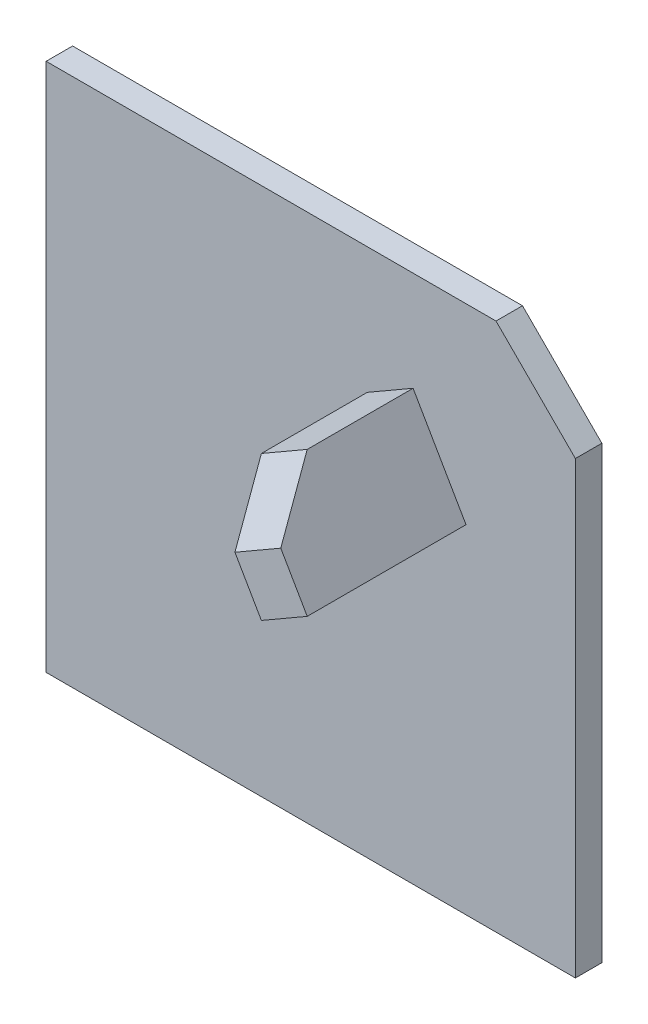
ISO-10303-21;
HEADER;
FILE_DESCRIPTION(('STEP AP214'),'2;1');
FILE_NAME('part.step','',(''),(''),'','','');
FILE_SCHEMA(('AUTOMOTIVE_DESIGN { 1 0 10303 214 1 1 1 1 }'));
ENDSEC;
DATA;
#1=APPLICATION_CONTEXT('core data for automotive mechanical design processes');
#2=APPLICATION_PROTOCOL_DEFINITION('international standard','automotive_design',2000,#1);
#3=PRODUCT_CONTEXT('',#1,'mechanical');
#4=PRODUCT('Part','Part','',(#3));
#5=PRODUCT_RELATED_PRODUCT_CATEGORY('part','',(#4));
#6=PRODUCT_DEFINITION_FORMATION('','',#4);
#7=PRODUCT_DEFINITION_CONTEXT('part definition',#1,'design');
#8=PRODUCT_DEFINITION('design','',#6,#7);
#9=PRODUCT_DEFINITION_SHAPE('','',#8);
#10=(LENGTH_UNIT() NAMED_UNIT(*) SI_UNIT(.MILLI.,.METRE.));
#11=(NAMED_UNIT(*) PLANE_ANGLE_UNIT() SI_UNIT($,.RADIAN.));
#12=(NAMED_UNIT(*) SI_UNIT($,.STERADIAN.) SOLID_ANGLE_UNIT());
#13=UNCERTAINTY_MEASURE_WITH_UNIT(LENGTH_MEASURE(1.E-05),#10,'distance_accuracy_value','');
#14=(GEOMETRIC_REPRESENTATION_CONTEXT(3) GLOBAL_UNCERTAINTY_ASSIGNED_CONTEXT((#13)) GLOBAL_UNIT_ASSIGNED_CONTEXT((#10,
#11,#12)) REPRESENTATION_CONTEXT('',''));
#15=CARTESIAN_POINT('',(0.,0.,0.));
#16=DIRECTION('',(0.,0.,1.));
#17=DIRECTION('',(1.,0.,0.));
#18=AXIS2_PLACEMENT_3D('',#15,#16,#17);
#19=CARTESIAN_POINT('',(53.349364905389,130.801270189222,175.));
#20=DIRECTION('',(0.866025403784438,0.500000000000001,0.));
#21=DIRECTION('',(-0.500000000000001,0.866025403784438,0.));
#22=AXIS2_PLACEMENT_3D('',#19,#20,#21);
#23=PLANE('',#22);
#24=DIRECTION('',(0.500000000000001,-0.866025403784438,0.));
#25=VECTOR('',#24,1.);
#26=CARTESIAN_POINT('',(53.349364905389,130.801270189222,175.));
#27=LINE('',#26,#25);
#28=CARTESIAN_POINT('',(78.349364905389,87.5,175.));
#29=VERTEX_POINT('',#28);
#30=CARTESIAN_POINT('',(103.349364905389,44.198729810778,175.));
#31=VERTEX_POINT('',#30);
#32=EDGE_CURVE('E191',#29,#31,#27,.T.);
#33=ORIENTED_EDGE('',*,*,#32,.F.);
#34=DIRECTION('',(0.353553390593273,-0.612372435695791,0.707106781186551));
#35=VECTOR('',#34,1.);
#36=CARTESIAN_POINT('',(53.349364905389,130.801270189222,124.999999999999));
#37=LINE('',#36,#35);
#38=CARTESIAN_POINT('',(53.349364905389,130.801270189222,124.999999999999));
#39=VERTEX_POINT('',#38);
#40=EDGE_CURVE('E54',#39,#29,#37,.T.);
#41=ORIENTED_EDGE('',*,*,#40,.F.);
#42=DIRECTION('',(0.,0.,-1.));
#43=VECTOR('',#42,1.);
#44=CARTESIAN_POINT('',(53.349364905389,130.801270189222,175.));
#45=LINE('',#44,#43);
#46=CARTESIAN_POINT('',(53.349364905389,130.801270189222,25.));
#47=VERTEX_POINT('',#46);
#48=EDGE_CURVE('E200',#39,#47,#45,.T.);
#49=ORIENTED_EDGE('',*,*,#48,.T.);
#50=DIRECTION('',(0.500000000000001,-0.866025403784438,0.));
#51=VECTOR('',#50,1.);
#52=CARTESIAN_POINT('',(53.349364905389,130.801270189222,25.));
#53=LINE('',#52,#51);
#54=CARTESIAN_POINT('',(103.349364905389,44.198729810778,25.));
#55=VERTEX_POINT('',#54);
#56=EDGE_CURVE('E190',#47,#55,#53,.T.);
#57=ORIENTED_EDGE('',*,*,#56,.T.);
#58=DIRECTION('',(0.,0.,-1.));
#59=VECTOR('',#58,1.);
#60=CARTESIAN_POINT('',(103.349364905389,44.198729810778,175.));
#61=LINE('',#60,#59);
#62=EDGE_CURVE('E48',#31,#55,#61,.T.);
#63=ORIENTED_EDGE('',*,*,#62,.F.);
#64=EDGE_LOOP('',(#33,#41,#49,#57,#63));
#65=FACE_BOUND('',#64,.T.);
#66=ADVANCED_FACE('F40',(#65),#23,.F.);
#67=CARTESIAN_POINT('',(103.349364905389,44.198729810778,175.));
#68=DIRECTION('',(-0.500000000000001,0.866025403784438,0.));
#69=DIRECTION('',(0.,0.,1.));
#70=AXIS2_PLACEMENT_3D('',#67,#68,#69);
#71=PLANE('',#70);
#72=DIRECTION('',(0.866025403784438,0.500000000000001,0.));
#73=VECTOR('',#72,1.);
#74=CARTESIAN_POINT('',(103.349364905389,44.198729810778,25.));
#75=LINE('',#74,#73);
#76=CARTESIAN_POINT('',(146.650635094611,69.1987298107781,25.));
#77=VERTEX_POINT('',#76);
#78=EDGE_CURVE('E204',#55,#77,#75,.T.);
#79=ORIENTED_EDGE('',*,*,#78,.T.);
#80=DIRECTION('',(0.,0.,-1.));
#81=VECTOR('',#80,1.);
#82=CARTESIAN_POINT('',(146.650635094611,69.1987298107781,175.));
#83=LINE('',#82,#81);
#84=CARTESIAN_POINT('',(146.650635094611,69.1987298107781,175.));
#85=VERTEX_POINT('',#84);
#86=EDGE_CURVE('E219',#85,#77,#83,.T.);
#87=ORIENTED_EDGE('',*,*,#86,.F.);
#88=DIRECTION('',(0.866025403784438,0.500000000000001,0.));
#89=VECTOR('',#88,1.);
#90=CARTESIAN_POINT('',(103.349364905389,44.198729810778,175.));
#91=LINE('',#90,#89);
#92=EDGE_CURVE('E63',#31,#85,#91,.T.);
#93=ORIENTED_EDGE('',*,*,#92,.F.);
#94=ORIENTED_EDGE('',*,*,#62,.T.);
#95=EDGE_LOOP('',(#79,#87,#93,#94));
#96=FACE_BOUND('',#95,.T.);
#97=ADVANCED_FACE('F226',(#96),#71,.F.);
#98=CARTESIAN_POINT('',(96.6506350946109,155.801270189222,175.));
#99=DIRECTION('',(-0.866025403784438,-0.500000000000001,0.));
#100=DIRECTION('',(0.500000000000001,-0.866025403784438,0.));
#101=AXIS2_PLACEMENT_3D('',#98,#99,#100);
#102=PLANE('',#101);
#103=DIRECTION('',(0.,0.,-1.));
#104=VECTOR('',#103,1.);
#105=CARTESIAN_POINT('',(96.6506350946109,155.801270189222,175.));
#106=LINE('',#105,#104);
#107=CARTESIAN_POINT('',(96.6506350946109,155.801270189222,124.999999999999));
#108=VERTEX_POINT('',#107);
#109=CARTESIAN_POINT('',(96.6506350946109,155.801270189222,25.));
#110=VERTEX_POINT('',#109);
#111=EDGE_CURVE('E215',#108,#110,#106,.T.);
#112=ORIENTED_EDGE('',*,*,#111,.F.);
#113=DIRECTION('',(0.353553390593273,-0.612372435695791,0.707106781186552));
#114=VECTOR('',#113,1.);
#115=CARTESIAN_POINT('',(109.150635094611,134.150635094611,150.));
#116=LINE('',#115,#114);
#117=CARTESIAN_POINT('',(121.650635094611,112.5,175.));
#118=VERTEX_POINT('',#117);
#119=EDGE_CURVE('E187',#108,#118,#116,.T.);
#120=ORIENTED_EDGE('',*,*,#119,.T.);
#121=DIRECTION('',(-0.500000000000001,0.866025403784438,0.));
#122=VECTOR('',#121,1.);
#123=CARTESIAN_POINT('',(96.6506350946109,155.801270189222,175.));
#124=LINE('',#123,#122);
#125=EDGE_CURVE('E197',#85,#118,#124,.T.);
#126=ORIENTED_EDGE('',*,*,#125,.F.);
#127=ORIENTED_EDGE('',*,*,#86,.T.);
#128=DIRECTION('',(-0.500000000000001,0.866025403784438,0.));
#129=VECTOR('',#128,1.);
#130=CARTESIAN_POINT('',(96.6506350946109,155.801270189222,25.));
#131=LINE('',#130,#129);
#132=EDGE_CURVE('E74',#77,#110,#131,.T.);
#133=ORIENTED_EDGE('',*,*,#132,.T.);
#134=EDGE_LOOP('',(#112,#120,#126,#127,#133));
#135=FACE_BOUND('',#134,.T.);
#136=ADVANCED_FACE('F235',(#135),#102,.F.);
#137=CARTESIAN_POINT('',(53.349364905389,130.801270189222,175.));
#138=DIRECTION('',(0.500000000000001,-0.866025403784438,0.));
#139=DIRECTION('',(0.,0.,-1.));
#140=AXIS2_PLACEMENT_3D('',#137,#138,#139);
#141=PLANE('',#140);
#142=ORIENTED_EDGE('',*,*,#48,.F.);
#143=DIRECTION('',(-0.866025403784438,-0.500000000000001,0.));
#144=VECTOR('',#143,1.);
#145=CARTESIAN_POINT('',(183.253175473055,205.801270189222,124.999999999999));
#146=LINE('',#145,#144);
#147=EDGE_CURVE('E184',#108,#39,#146,.T.);
#148=ORIENTED_EDGE('',*,*,#147,.F.);
#149=ORIENTED_EDGE('',*,*,#111,.T.);
#150=DIRECTION('',(-0.866025403784438,-0.500000000000001,0.));
#151=VECTOR('',#150,1.);
#152=CARTESIAN_POINT('',(53.349364905389,130.801270189222,25.));
#153=LINE('',#152,#151);
#154=EDGE_CURVE('E194',#110,#47,#153,.T.);
#155=ORIENTED_EDGE('',*,*,#154,.T.);
#156=EDGE_LOOP('',(#142,#148,#149,#155));
#157=FACE_BOUND('',#156,.T.);
#158=ADVANCED_FACE('F233',(#157),#141,.F.);
#159=CARTESIAN_POINT('',(100.,100.,175.));
#160=DIRECTION('',(0.,0.,1.));
#161=DIRECTION('',(0.866025403784438,0.500000000000001,0.));
#162=AXIS2_PLACEMENT_3D('',#159,#160,#161);
#163=PLANE('',#162);
#164=DIRECTION('',(0.866025403784438,0.500000000000001,0.));
#165=VECTOR('',#164,1.);
#166=CARTESIAN_POINT('',(100.,100.,175.));
#167=LINE('',#166,#165);
#168=EDGE_CURVE('E11',#29,#118,#167,.T.);
#169=ORIENTED_EDGE('',*,*,#168,.F.);
#170=ORIENTED_EDGE('',*,*,#32,.T.);
#171=ORIENTED_EDGE('',*,*,#92,.T.);
#172=ORIENTED_EDGE('',*,*,#125,.T.);
#173=EDGE_LOOP('',(#169,#170,#171,#172));
#174=FACE_BOUND('',#173,.T.);
#175=ADVANCED_FACE('F237',(#174),#163,.T.);
#176=CARTESIAN_POINT('',(183.253175473055,205.801270189222,124.999999999999));
#177=DIRECTION('',(0.353553390593277,-0.612372435695798,-0.707106781186544));
#178=DIRECTION('',(-0.353553390593273,0.612372435695791,-0.707106781186552));
#179=AXIS2_PLACEMENT_3D('',#176,#177,#178);
#180=PLANE('',#179);
#181=ORIENTED_EDGE('',*,*,#147,.T.);
#182=ORIENTED_EDGE('',*,*,#40,.T.);
#183=ORIENTED_EDGE('',*,*,#168,.T.);
#184=ORIENTED_EDGE('',*,*,#119,.F.);
#185=EDGE_LOOP('',(#181,#182,#183,#184));
#186=FACE_BOUND('',#185,.T.);
#187=ADVANCED_FACE('F239',(#186),#180,.F.);
#188=CARTESIAN_POINT('',(-250.,-250.,25.));
#189=DIRECTION('',(1.,0.,0.));
#190=DIRECTION('',(0.,0.,-1.));
#191=AXIS2_PLACEMENT_3D('',#188,#189,#190);
#192=PLANE('',#191);
#193=DIRECTION('',(0.,-1.,0.));
#194=VECTOR('',#193,1.);
#195=CARTESIAN_POINT('',(-250.,-250.,0.));
#196=LINE('',#195,#194);
#197=CARTESIAN_POINT('',(-250.,250.,0.));
#198=VERTEX_POINT('',#197);
#199=CARTESIAN_POINT('',(-250.,-250.,0.));
#200=VERTEX_POINT('',#199);
#201=EDGE_CURVE('E158',#198,#200,#196,.T.);
#202=ORIENTED_EDGE('',*,*,#201,.T.);
#203=DIRECTION('',(0.,0.,-1.));
#204=VECTOR('',#203,1.);
#205=CARTESIAN_POINT('',(-250.,-250.,25.));
#206=LINE('',#205,#204);
#207=CARTESIAN_POINT('',(-250.,-250.,25.));
#208=VERTEX_POINT('',#207);
#209=EDGE_CURVE('E176',#208,#200,#206,.T.);
#210=ORIENTED_EDGE('',*,*,#209,.F.);
#211=DIRECTION('',(0.,-1.,0.));
#212=VECTOR('',#211,1.);
#213=CARTESIAN_POINT('',(-250.,-250.,25.));
#214=LINE('',#213,#212);
#215=CARTESIAN_POINT('',(-250.,250.,25.));
#216=VERTEX_POINT('',#215);
#217=EDGE_CURVE('E171',#216,#208,#214,.T.);
#218=ORIENTED_EDGE('',*,*,#217,.F.);
#219=DIRECTION('',(0.,0.,-1.));
#220=VECTOR('',#219,1.);
#221=CARTESIAN_POINT('',(-250.,250.,25.));
#222=LINE('',#221,#220);
#223=EDGE_CURVE('E146',#216,#198,#222,.T.);
#224=ORIENTED_EDGE('',*,*,#223,.T.);
#225=EDGE_LOOP('',(#202,#210,#218,#224));
#226=FACE_BOUND('',#225,.T.);
#227=ADVANCED_FACE('F244',(#226),#192,.F.);
#228=CARTESIAN_POINT('',(-250.,-250.,25.));
#229=DIRECTION('',(0.,1.,0.));
#230=DIRECTION('',(0.,0.,1.));
#231=AXIS2_PLACEMENT_3D('',#228,#229,#230);
#232=PLANE('',#231);
#233=DIRECTION('',(1.,0.,0.));
#234=VECTOR('',#233,1.);
#235=CARTESIAN_POINT('',(-250.,-250.,0.));
#236=LINE('',#235,#234);
#237=CARTESIAN_POINT('',(250.,-250.,0.));
#238=VERTEX_POINT('',#237);
#239=EDGE_CURVE('E162',#200,#238,#236,.T.);
#240=ORIENTED_EDGE('',*,*,#239,.T.);
#241=DIRECTION('',(0.,0.,-1.));
#242=VECTOR('',#241,1.);
#243=CARTESIAN_POINT('',(250.,-250.,25.));
#244=LINE('',#243,#242);
#245=CARTESIAN_POINT('',(250.,-250.,25.));
#246=VERTEX_POINT('',#245);
#247=EDGE_CURVE('E152',#246,#238,#244,.T.);
#248=ORIENTED_EDGE('',*,*,#247,.F.);
#249=DIRECTION('',(1.,0.,0.));
#250=VECTOR('',#249,1.);
#251=CARTESIAN_POINT('',(-250.,-250.,25.));
#252=LINE('',#251,#250);
#253=EDGE_CURVE('E154',#208,#246,#252,.T.);
#254=ORIENTED_EDGE('',*,*,#253,.F.);
#255=ORIENTED_EDGE('',*,*,#209,.T.);
#256=EDGE_LOOP('',(#240,#248,#254,#255));
#257=FACE_BOUND('',#256,.T.);
#258=ADVANCED_FACE('F263',(#257),#232,.F.);
#259=CARTESIAN_POINT('',(250.,250.,25.));
#260=DIRECTION('',(-1.,0.,0.));
#261=DIRECTION('',(0.,-1.,0.));
#262=AXIS2_PLACEMENT_3D('',#259,#260,#261);
#263=PLANE('',#262);
#264=DIRECTION('',(0.,1.,0.));
#265=VECTOR('',#264,1.);
#266=CARTESIAN_POINT('',(250.,250.,0.));
#267=LINE('',#266,#265);
#268=CARTESIAN_POINT('',(250.,175.,0.));
#269=VERTEX_POINT('',#268);
#270=EDGE_CURVE('E165',#238,#269,#267,.T.);
#271=ORIENTED_EDGE('',*,*,#270,.T.);
#272=DIRECTION('',(0.,0.,1.));
#273=VECTOR('',#272,1.);
#274=CARTESIAN_POINT('',(250.,175.,-0.399999999999998));
#275=LINE('',#274,#273);
#276=CARTESIAN_POINT('',(250.,175.,25.));
#277=VERTEX_POINT('',#276);
#278=EDGE_CURVE('E132',#269,#277,#275,.T.);
#279=ORIENTED_EDGE('',*,*,#278,.T.);
#280=DIRECTION('',(0.,1.,0.));
#281=VECTOR('',#280,1.);
#282=CARTESIAN_POINT('',(250.,250.,25.));
#283=LINE('',#282,#281);
#284=EDGE_CURVE('E141',#246,#277,#283,.T.);
#285=ORIENTED_EDGE('',*,*,#284,.F.);
#286=ORIENTED_EDGE('',*,*,#247,.T.);
#287=EDGE_LOOP('',(#271,#279,#285,#286));
#288=FACE_BOUND('',#287,.T.);
#289=ADVANCED_FACE('F270',(#288),#263,.F.);
#290=CARTESIAN_POINT('',(-250.,250.,25.));
#291=DIRECTION('',(0.,-1.,0.));
#292=DIRECTION('',(0.,0.,-1.));
#293=AXIS2_PLACEMENT_3D('',#290,#291,#292);
#294=PLANE('',#293);
#295=DIRECTION('',(-1.,0.,0.));
#296=VECTOR('',#295,1.);
#297=CARTESIAN_POINT('',(-250.,250.,25.));
#298=LINE('',#297,#296);
#299=CARTESIAN_POINT('',(175.,250.,25.));
#300=VERTEX_POINT('',#299);
#301=EDGE_CURVE('E138',#300,#216,#298,.T.);
#302=ORIENTED_EDGE('',*,*,#301,.F.);
#303=DIRECTION('',(0.,0.,1.));
#304=VECTOR('',#303,1.);
#305=CARTESIAN_POINT('',(175.,250.,-0.399999999999998));
#306=LINE('',#305,#304);
#307=CARTESIAN_POINT('',(175.,250.,0.));
#308=VERTEX_POINT('',#307);
#309=EDGE_CURVE('E121',#308,#300,#306,.T.);
#310=ORIENTED_EDGE('',*,*,#309,.F.);
#311=DIRECTION('',(-1.,0.,0.));
#312=VECTOR('',#311,1.);
#313=CARTESIAN_POINT('',(-250.,250.,0.));
#314=LINE('',#313,#312);
#315=EDGE_CURVE('E169',#308,#198,#314,.T.);
#316=ORIENTED_EDGE('',*,*,#315,.T.);
#317=ORIENTED_EDGE('',*,*,#223,.F.);
#318=EDGE_LOOP('',(#302,#310,#316,#317));
#319=FACE_BOUND('',#318,.T.);
#320=ADVANCED_FACE('F144',(#319),#294,.F.);
#321=CARTESIAN_POINT('',(0.,0.,25.));
#322=DIRECTION('',(0.,0.,-1.));
#323=DIRECTION('',(-1.,0.,0.));
#324=AXIS2_PLACEMENT_3D('',#321,#322,#323);
#325=PLANE('',#324);
#326=ORIENTED_EDGE('',*,*,#56,.F.);
#327=ORIENTED_EDGE('',*,*,#154,.F.);
#328=ORIENTED_EDGE('',*,*,#132,.F.);
#329=ORIENTED_EDGE('',*,*,#78,.F.);
#330=EDGE_LOOP('',(#326,#327,#328,#329));
#331=FACE_BOUND('',#330,.T.);
#332=ORIENTED_EDGE('',*,*,#284,.T.);
#333=DIRECTION('',(0.707106781186547,-0.707106781186548,0.));
#334=VECTOR('',#333,1.);
#335=CARTESIAN_POINT('',(175.,250.,25.));
#336=LINE('',#335,#334);
#337=EDGE_CURVE('E124',#300,#277,#336,.T.);
#338=ORIENTED_EDGE('',*,*,#337,.F.);
#339=ORIENTED_EDGE('',*,*,#301,.T.);
#340=ORIENTED_EDGE('',*,*,#217,.T.);
#341=ORIENTED_EDGE('',*,*,#253,.T.);
#342=EDGE_LOOP('',(#332,#338,#339,#340,#341));
#343=FACE_BOUND('',#342,.T.);
#344=ADVANCED_FACE('F136',(#331,#343),#325,.F.);
#345=CARTESIAN_POINT('',(0.,0.,0.));
#346=DIRECTION('',(0.,0.,-1.));
#347=DIRECTION('',(-1.,0.,0.));
#348=AXIS2_PLACEMENT_3D('',#345,#346,#347);
#349=PLANE('',#348);
#350=DIRECTION('',(-0.707106781186547,0.707106781186548,0.));
#351=VECTOR('',#350,1.);
#352=CARTESIAN_POINT('',(212.5,212.5,0.));
#353=LINE('',#352,#351);
#354=EDGE_CURVE('E127',#269,#308,#353,.T.);
#355=ORIENTED_EDGE('',*,*,#354,.F.);
#356=ORIENTED_EDGE('',*,*,#270,.F.);
#357=ORIENTED_EDGE('',*,*,#239,.F.);
#358=ORIENTED_EDGE('',*,*,#201,.F.);
#359=ORIENTED_EDGE('',*,*,#315,.F.);
#360=EDGE_LOOP('',(#355,#356,#357,#358,#359));
#361=FACE_BOUND('',#360,.T.);
#362=ADVANCED_FACE('F288',(#361),#349,.T.);
#363=CARTESIAN_POINT('',(175.,250.,-0.399999999999998));
#364=DIRECTION('',(-0.707106781186548,-0.707106781186547,0.));
#365=DIRECTION('',(0.707106781186547,-0.707106781186548,0.));
#366=AXIS2_PLACEMENT_3D('',#363,#364,#365);
#367=PLANE('',#366);
#368=ORIENTED_EDGE('',*,*,#354,.T.);
#369=ORIENTED_EDGE('',*,*,#309,.T.);
#370=ORIENTED_EDGE('',*,*,#337,.T.);
#371=ORIENTED_EDGE('',*,*,#278,.F.);
#372=EDGE_LOOP('',(#368,#369,#370,#371));
#373=FACE_BOUND('',#372,.T.);
#374=ADVANCED_FACE('F123',(#373),#367,.F.);
#375=CLOSED_SHELL('',(#66,#97,#136,#158,#175,#187,#227,#258,#289,#320,#344,#362,#374));
#376=MANIFOLD_SOLID_BREP('B2',#375);
#377=ADVANCED_BREP_SHAPE_REPRESENTATION('',(#18,#376),#14);
#378=SHAPE_DEFINITION_REPRESENTATION(#9,#377);
ENDSEC;
END-ISO-10303-21;
